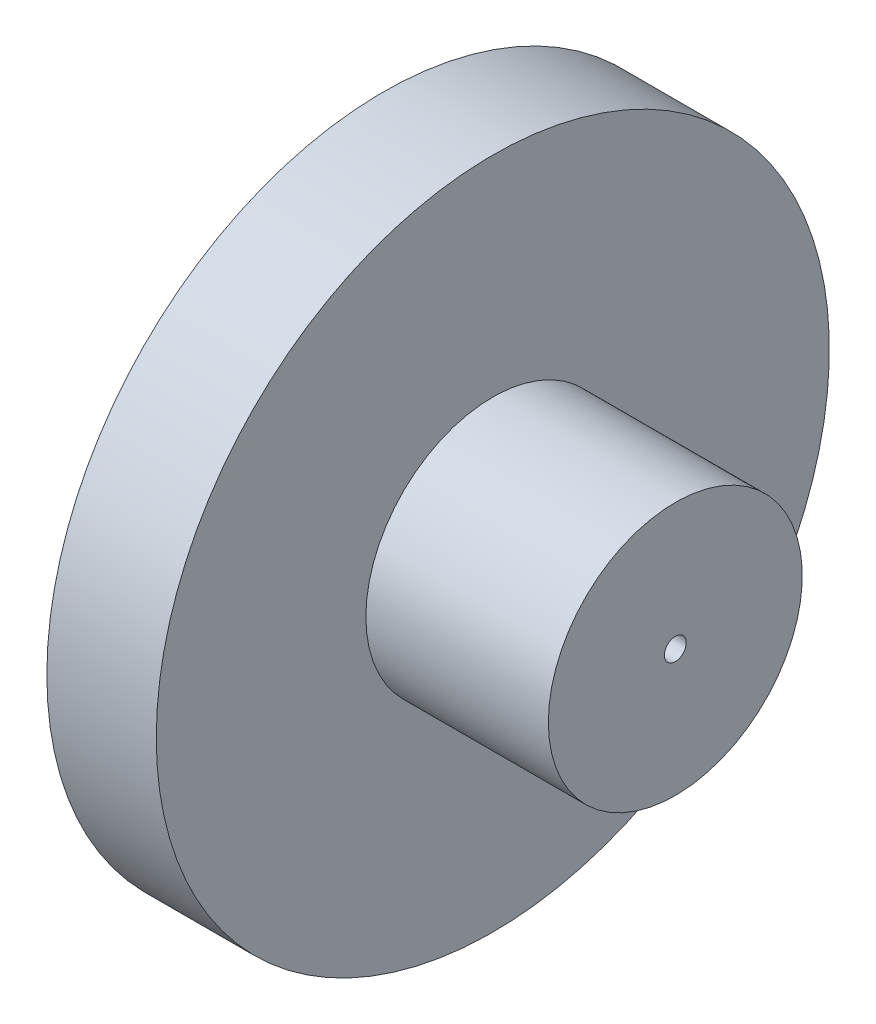
ISO-10303-21;
HEADER;
FILE_DESCRIPTION(('STEP AP214'),'2;1');
FILE_NAME('part.step','',(''),(''),'','','');
FILE_SCHEMA(('AUTOMOTIVE_DESIGN { 1 0 10303 214 1 1 1 1 }'));
ENDSEC;
DATA;
#1=APPLICATION_CONTEXT('core data for automotive mechanical design processes');
#2=APPLICATION_PROTOCOL_DEFINITION('international standard','automotive_design',2000,#1);
#3=PRODUCT_CONTEXT('',#1,'mechanical');
#4=PRODUCT('Part','Part','',(#3));
#5=PRODUCT_RELATED_PRODUCT_CATEGORY('part','',(#4));
#6=PRODUCT_DEFINITION_FORMATION('','',#4);
#7=PRODUCT_DEFINITION_CONTEXT('part definition',#1,'design');
#8=PRODUCT_DEFINITION('design','',#6,#7);
#9=PRODUCT_DEFINITION_SHAPE('','',#8);
#10=(LENGTH_UNIT() NAMED_UNIT(*) SI_UNIT(.MILLI.,.METRE.));
#11=(NAMED_UNIT(*) PLANE_ANGLE_UNIT() SI_UNIT($,.RADIAN.));
#12=(NAMED_UNIT(*) SI_UNIT($,.STERADIAN.) SOLID_ANGLE_UNIT());
#13=UNCERTAINTY_MEASURE_WITH_UNIT(LENGTH_MEASURE(1.E-05),#10,'distance_accuracy_value','');
#14=(GEOMETRIC_REPRESENTATION_CONTEXT(3) GLOBAL_UNCERTAINTY_ASSIGNED_CONTEXT((#13)) GLOBAL_UNIT_ASSIGNED_CONTEXT((#10,
#11,#12)) REPRESENTATION_CONTEXT('',''));
#15=CARTESIAN_POINT('',(0.,0.,0.));
#16=DIRECTION('',(0.,0.,1.));
#17=DIRECTION('',(1.,0.,0.));
#18=AXIS2_PLACEMENT_3D('',#15,#16,#17);
#19=CARTESIAN_POINT('',(-37.4119891938212,0.,0.));
#20=DIRECTION('',(-1.,0.,0.));
#21=DIRECTION('',(0.,0.,1.));
#22=AXIS2_PLACEMENT_3D('',#19,#20,#21);
#23=CYLINDRICAL_SURFACE('',#22,4.99999999999999);
#24=CARTESIAN_POINT('',(106.,0.,0.));
#25=DIRECTION('',(-1.,0.,0.));
#26=DIRECTION('',(0.,0.,1.));
#27=AXIS2_PLACEMENT_3D('',#24,#25,#26);
#28=CIRCLE('',#27,4.99999999999999);
#29=CARTESIAN_POINT('',(106.,0.,4.99999999999999));
#30=VERTEX_POINT('',#29);
#31=EDGE_CURVE('E78',#30,#30,#28,.T.);
#32=ORIENTED_EDGE('',*,*,#31,.F.);
#33=EDGE_LOOP('',(#32));
#34=FACE_BOUND('',#33,.T.);
#35=CARTESIAN_POINT('',(-106.,0.,0.));
#36=DIRECTION('',(-1.,0.,0.));
#37=DIRECTION('',(0.,0.,1.));
#38=AXIS2_PLACEMENT_3D('',#35,#36,#37);
#39=CIRCLE('',#38,4.99999999999999);
#40=CARTESIAN_POINT('',(-106.,0.,4.99999999999999));
#41=VERTEX_POINT('',#40);
#42=EDGE_CURVE('E10',#41,#41,#39,.T.);
#43=ORIENTED_EDGE('',*,*,#42,.T.);
#44=EDGE_LOOP('',(#43));
#45=FACE_BOUND('',#44,.T.);
#46=ADVANCED_FACE('F43',(#34,#45),#23,.F.);
#47=CARTESIAN_POINT('',(-106.,4.99999999999999,0.));
#48=DIRECTION('',(1.,0.,0.));
#49=DIRECTION('',(0.,0.,-1.));
#50=AXIS2_PLACEMENT_3D('',#47,#48,#49);
#51=PLANE('',#50);
#52=ORIENTED_EDGE('',*,*,#42,.F.);
#53=EDGE_LOOP('',(#52));
#54=FACE_BOUND('',#53,.T.);
#55=CARTESIAN_POINT('',(-106.,0.,0.));
#56=DIRECTION('',(-1.,0.,0.));
#57=DIRECTION('',(0.,0.,1.));
#58=AXIS2_PLACEMENT_3D('',#55,#56,#57);
#59=CIRCLE('',#58,32.8101481975016);
#60=CARTESIAN_POINT('',(-106.,0.,32.8101481975016));
#61=VERTEX_POINT('',#60);
#62=EDGE_CURVE('E50',#61,#61,#59,.T.);
#63=ORIENTED_EDGE('',*,*,#62,.T.);
#64=EDGE_LOOP('',(#63));
#65=FACE_BOUND('',#64,.T.);
#66=ADVANCED_FACE('F86',(#54,#65),#51,.F.);
#67=CARTESIAN_POINT('',(-37.4119891938212,0.,0.));
#68=DIRECTION('',(-1.,0.,0.));
#69=DIRECTION('',(0.,0.,1.));
#70=AXIS2_PLACEMENT_3D('',#67,#68,#69);
#71=CYLINDRICAL_SURFACE('',#70,32.8101481975016);
#72=ORIENTED_EDGE('',*,*,#62,.F.);
#73=EDGE_LOOP('',(#72));
#74=FACE_BOUND('',#73,.T.);
#75=CARTESIAN_POINT('',(-27.4077092491987,0.,0.));
#76=DIRECTION('',(-1.,0.,0.));
#77=DIRECTION('',(0.,0.,1.));
#78=AXIS2_PLACEMENT_3D('',#75,#76,#77);
#79=CIRCLE('',#78,32.8101481975016);
#80=CARTESIAN_POINT('',(-27.4077092491987,0.,32.8101481975016));
#81=VERTEX_POINT('',#80);
#82=EDGE_CURVE('E55',#81,#81,#79,.T.);
#83=ORIENTED_EDGE('',*,*,#82,.T.);
#84=EDGE_LOOP('',(#83));
#85=FACE_BOUND('',#84,.T.);
#86=ADVANCED_FACE('F90',(#74,#85),#71,.T.);
#87=CARTESIAN_POINT('',(-27.4077092491987,32.8101481975016,0.));
#88=DIRECTION('',(1.,0.,0.));
#89=DIRECTION('',(0.,0.,-1.));
#90=AXIS2_PLACEMENT_3D('',#87,#88,#89);
#91=PLANE('',#90);
#92=ORIENTED_EDGE('',*,*,#82,.F.);
#93=EDGE_LOOP('',(#92));
#94=FACE_BOUND('',#93,.T.);
#95=CARTESIAN_POINT('',(-27.4077092491987,0.,0.));
#96=DIRECTION('',(-1.,0.,0.));
#97=DIRECTION('',(0.,0.,1.));
#98=AXIS2_PLACEMENT_3D('',#95,#96,#97);
#99=CIRCLE('',#98,153.810148197502);
#100=CARTESIAN_POINT('',(-27.4077092491987,0.,153.810148197502));
#101=VERTEX_POINT('',#100);
#102=EDGE_CURVE('E60',#101,#101,#99,.T.);
#103=ORIENTED_EDGE('',*,*,#102,.T.);
#104=EDGE_LOOP('',(#103));
#105=FACE_BOUND('',#104,.T.);
#106=ADVANCED_FACE('F95',(#94,#105),#91,.F.);
#107=CARTESIAN_POINT('',(-37.4119891938212,0.,0.));
#108=DIRECTION('',(-1.,0.,0.));
#109=DIRECTION('',(0.,0.,1.));
#110=AXIS2_PLACEMENT_3D('',#107,#108,#109);
#111=CYLINDRICAL_SURFACE('',#110,153.810148197502);
#112=ORIENTED_EDGE('',*,*,#102,.F.);
#113=EDGE_LOOP('',(#112));
#114=FACE_BOUND('',#113,.T.);
#115=CARTESIAN_POINT('',(22.5922907508013,0.,0.));
#116=DIRECTION('',(-1.,0.,0.));
#117=DIRECTION('',(0.,0.,1.));
#118=AXIS2_PLACEMENT_3D('',#115,#116,#117);
#119=CIRCLE('',#118,153.810148197502);
#120=CARTESIAN_POINT('',(22.5922907508013,0.,153.810148197502));
#121=VERTEX_POINT('',#120);
#122=EDGE_CURVE('E66',#121,#121,#119,.T.);
#123=ORIENTED_EDGE('',*,*,#122,.T.);
#124=EDGE_LOOP('',(#123));
#125=FACE_BOUND('',#124,.T.);
#126=ADVANCED_FACE('F101',(#114,#125),#111,.T.);
#127=CARTESIAN_POINT('',(22.5922907508013,153.810148197502,0.));
#128=DIRECTION('',(-1.,0.,0.));
#129=DIRECTION('',(0.,0.,1.));
#130=AXIS2_PLACEMENT_3D('',#127,#128,#129);
#131=PLANE('',#130);
#132=ORIENTED_EDGE('',*,*,#122,.F.);
#133=EDGE_LOOP('',(#132));
#134=FACE_BOUND('',#133,.T.);
#135=CARTESIAN_POINT('',(22.5922907508013,0.,0.));
#136=DIRECTION('',(-1.,0.,0.));
#137=DIRECTION('',(0.,0.,1.));
#138=AXIS2_PLACEMENT_3D('',#135,#136,#137);
#139=CIRCLE('',#138,58.0227860469867);
#140=CARTESIAN_POINT('',(22.5922907508013,0.,58.0227860469867));
#141=VERTEX_POINT('',#140);
#142=EDGE_CURVE('E70',#141,#141,#139,.T.);
#143=ORIENTED_EDGE('',*,*,#142,.T.);
#144=EDGE_LOOP('',(#143));
#145=FACE_BOUND('',#144,.T.);
#146=ADVANCED_FACE('F105',(#134,#145),#131,.F.);
#147=CARTESIAN_POINT('',(-37.4119891938212,0.,0.));
#148=DIRECTION('',(-1.,0.,0.));
#149=DIRECTION('',(0.,0.,1.));
#150=AXIS2_PLACEMENT_3D('',#147,#148,#149);
#151=CYLINDRICAL_SURFACE('',#150,58.0227860469867);
#152=ORIENTED_EDGE('',*,*,#142,.F.);
#153=EDGE_LOOP('',(#152));
#154=FACE_BOUND('',#153,.T.);
#155=CARTESIAN_POINT('',(106.,0.,0.));
#156=DIRECTION('',(-1.,0.,0.));
#157=DIRECTION('',(0.,0.,1.));
#158=AXIS2_PLACEMENT_3D('',#155,#156,#157);
#159=CIRCLE('',#158,58.0227860469867);
#160=CARTESIAN_POINT('',(106.,0.,58.0227860469867));
#161=VERTEX_POINT('',#160);
#162=EDGE_CURVE('E74',#161,#161,#159,.T.);
#163=ORIENTED_EDGE('',*,*,#162,.T.);
#164=EDGE_LOOP('',(#163));
#165=FACE_BOUND('',#164,.T.);
#166=ADVANCED_FACE('F109',(#154,#165),#151,.T.);
#167=CARTESIAN_POINT('',(106.,58.0227860469867,0.));
#168=DIRECTION('',(-1.,0.,0.));
#169=DIRECTION('',(0.,0.,1.));
#170=AXIS2_PLACEMENT_3D('',#167,#168,#169);
#171=PLANE('',#170);
#172=ORIENTED_EDGE('',*,*,#162,.F.);
#173=EDGE_LOOP('',(#172));
#174=FACE_BOUND('',#173,.T.);
#175=ORIENTED_EDGE('',*,*,#31,.T.);
#176=EDGE_LOOP('',(#175));
#177=FACE_BOUND('',#176,.T.);
#178=ADVANCED_FACE('F83',(#174,#177),#171,.F.);
#179=CLOSED_SHELL('',(#46,#66,#86,#106,#126,#146,#166,#178));
#180=MANIFOLD_SOLID_BREP('B2',#179);
#181=ADVANCED_BREP_SHAPE_REPRESENTATION('',(#18,#180),#14);
#182=SHAPE_DEFINITION_REPRESENTATION(#9,#181);
ENDSEC;
END-ISO-10303-21;
